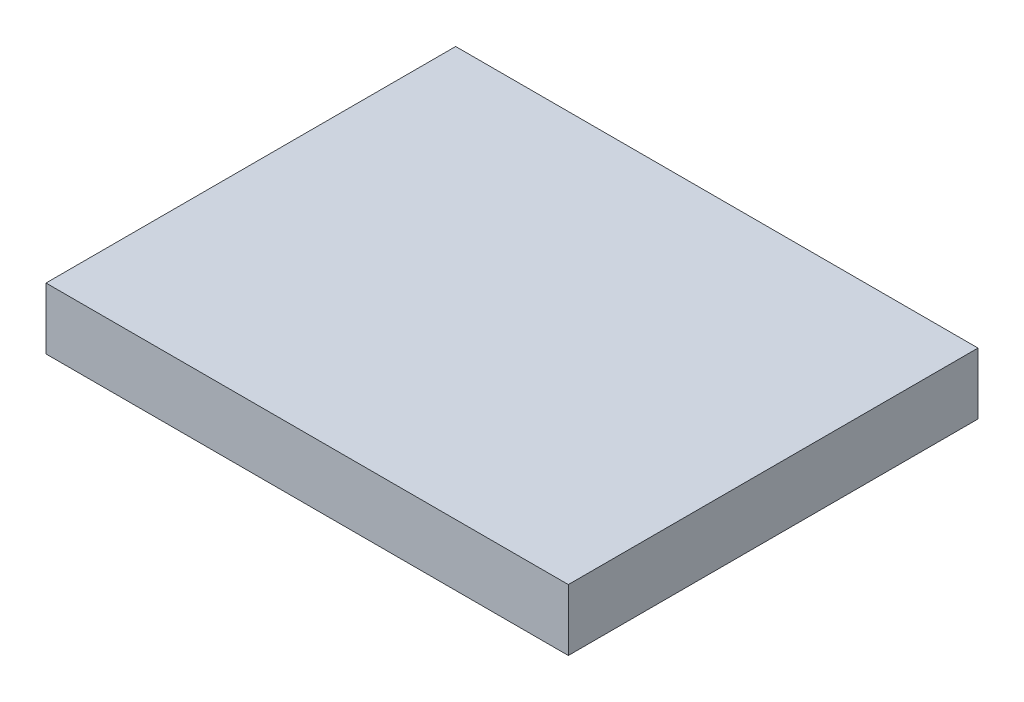
ISO-10303-21;
HEADER;
FILE_DESCRIPTION(('STEP AP214'),'2;1');
FILE_NAME('part.step','',(''),(''),'','','');
FILE_SCHEMA(('AUTOMOTIVE_DESIGN { 1 0 10303 214 1 1 1 1 }'));
ENDSEC;
DATA;
#1=APPLICATION_CONTEXT('core data for automotive mechanical design processes');
#2=APPLICATION_PROTOCOL_DEFINITION('international standard','automotive_design',2000,#1);
#3=PRODUCT_CONTEXT('',#1,'mechanical');
#4=PRODUCT('Part','Part','',(#3));
#5=PRODUCT_RELATED_PRODUCT_CATEGORY('part','',(#4));
#6=PRODUCT_DEFINITION_FORMATION('','',#4);
#7=PRODUCT_DEFINITION_CONTEXT('part definition',#1,'design');
#8=PRODUCT_DEFINITION('design','',#6,#7);
#9=PRODUCT_DEFINITION_SHAPE('','',#8);
#10=(LENGTH_UNIT() NAMED_UNIT(*) SI_UNIT(.MILLI.,.METRE.));
#11=(NAMED_UNIT(*) PLANE_ANGLE_UNIT() SI_UNIT($,.RADIAN.));
#12=(NAMED_UNIT(*) SI_UNIT($,.STERADIAN.) SOLID_ANGLE_UNIT());
#13=UNCERTAINTY_MEASURE_WITH_UNIT(LENGTH_MEASURE(1.E-05),#10,'distance_accuracy_value','');
#14=(GEOMETRIC_REPRESENTATION_CONTEXT(3) GLOBAL_UNCERTAINTY_ASSIGNED_CONTEXT((#13)) GLOBAL_UNIT_ASSIGNED_CONTEXT((#10,
#11,#12)) REPRESENTATION_CONTEXT('',''));
#15=CARTESIAN_POINT('',(0.,0.,0.));
#16=DIRECTION('',(0.,0.,1.));
#17=DIRECTION('',(1.,0.,0.));
#18=AXIS2_PLACEMENT_3D('',#15,#16,#17);
#19=CARTESIAN_POINT('',(25.5,6.,-20.));
#20=DIRECTION('',(-1.,0.,0.));
#21=DIRECTION('',(0.,0.,1.));
#22=AXIS2_PLACEMENT_3D('',#19,#20,#21);
#23=PLANE('',#22);
#24=DIRECTION('',(0.,0.,-1.));
#25=VECTOR('',#24,1.);
#26=CARTESIAN_POINT('',(25.5,0.,-20.));
#27=LINE('',#26,#25);
#28=CARTESIAN_POINT('',(25.5,0.,20.));
#29=VERTEX_POINT('',#28);
#30=CARTESIAN_POINT('',(25.5,0.,-20.));
#31=VERTEX_POINT('',#30);
#32=EDGE_CURVE('E98',#29,#31,#27,.T.);
#33=ORIENTED_EDGE('',*,*,#32,.T.);
#34=DIRECTION('',(0.,-1.,0.));
#35=VECTOR('',#34,1.);
#36=CARTESIAN_POINT('',(25.5,6.,-20.));
#37=LINE('',#36,#35);
#38=CARTESIAN_POINT('',(25.5,6.,-20.));
#39=VERTEX_POINT('',#38);
#40=EDGE_CURVE('E11',#39,#31,#37,.T.);
#41=ORIENTED_EDGE('',*,*,#40,.F.);
#42=DIRECTION('',(0.,0.,-1.));
#43=VECTOR('',#42,1.);
#44=CARTESIAN_POINT('',(25.5,6.,-20.));
#45=LINE('',#44,#43);
#46=CARTESIAN_POINT('',(25.5,6.,20.));
#47=VERTEX_POINT('',#46);
#48=EDGE_CURVE('E86',#47,#39,#45,.T.);
#49=ORIENTED_EDGE('',*,*,#48,.F.);
#50=DIRECTION('',(0.,-1.,0.));
#51=VECTOR('',#50,1.);
#52=CARTESIAN_POINT('',(25.5,6.,20.));
#53=LINE('',#52,#51);
#54=EDGE_CURVE('E94',#47,#29,#53,.T.);
#55=ORIENTED_EDGE('',*,*,#54,.T.);
#56=EDGE_LOOP('',(#33,#41,#49,#55));
#57=FACE_BOUND('',#56,.T.);
#58=ADVANCED_FACE('F35',(#57),#23,.F.);
#59=CARTESIAN_POINT('',(-25.5,6.,-20.));
#60=DIRECTION('',(0.,0.,1.));
#61=DIRECTION('',(1.,0.,0.));
#62=AXIS2_PLACEMENT_3D('',#59,#60,#61);
#63=PLANE('',#62);
#64=DIRECTION('',(-1.,0.,0.));
#65=VECTOR('',#64,1.);
#66=CARTESIAN_POINT('',(-25.5,0.,-20.));
#67=LINE('',#66,#65);
#68=CARTESIAN_POINT('',(-25.5,0.,-20.));
#69=VERTEX_POINT('',#68);
#70=EDGE_CURVE('E90',#31,#69,#67,.T.);
#71=ORIENTED_EDGE('',*,*,#70,.T.);
#72=DIRECTION('',(0.,-1.,0.));
#73=VECTOR('',#72,1.);
#74=CARTESIAN_POINT('',(-25.5,6.,-20.));
#75=LINE('',#74,#73);
#76=CARTESIAN_POINT('',(-25.5,6.,-20.));
#77=VERTEX_POINT('',#76);
#78=EDGE_CURVE('E43',#77,#69,#75,.T.);
#79=ORIENTED_EDGE('',*,*,#78,.F.);
#80=DIRECTION('',(-1.,0.,0.));
#81=VECTOR('',#80,1.);
#82=CARTESIAN_POINT('',(-25.5,6.,-20.));
#83=LINE('',#82,#81);
#84=EDGE_CURVE('E81',#39,#77,#83,.T.);
#85=ORIENTED_EDGE('',*,*,#84,.F.);
#86=ORIENTED_EDGE('',*,*,#40,.T.);
#87=EDGE_LOOP('',(#71,#79,#85,#86));
#88=FACE_BOUND('',#87,.T.);
#89=ADVANCED_FACE('F89',(#88),#63,.F.);
#90=CARTESIAN_POINT('',(-25.5,6.,-20.));
#91=DIRECTION('',(1.,0.,0.));
#92=DIRECTION('',(0.,0.,-1.));
#93=AXIS2_PLACEMENT_3D('',#90,#91,#92);
#94=PLANE('',#93);
#95=DIRECTION('',(0.,0.,1.));
#96=VECTOR('',#95,1.);
#97=CARTESIAN_POINT('',(-25.5,0.,-20.));
#98=LINE('',#97,#96);
#99=CARTESIAN_POINT('',(-25.5,0.,20.));
#100=VERTEX_POINT('',#99);
#101=EDGE_CURVE('E68',#69,#100,#98,.T.);
#102=ORIENTED_EDGE('',*,*,#101,.T.);
#103=DIRECTION('',(0.,-1.,0.));
#104=VECTOR('',#103,1.);
#105=CARTESIAN_POINT('',(-25.5,6.,20.));
#106=LINE('',#105,#104);
#107=CARTESIAN_POINT('',(-25.5,6.,20.));
#108=VERTEX_POINT('',#107);
#109=EDGE_CURVE('E91',#108,#100,#106,.T.);
#110=ORIENTED_EDGE('',*,*,#109,.F.);
#111=DIRECTION('',(0.,0.,1.));
#112=VECTOR('',#111,1.);
#113=CARTESIAN_POINT('',(-25.5,6.,-20.));
#114=LINE('',#113,#112);
#115=EDGE_CURVE('E84',#77,#108,#114,.T.);
#116=ORIENTED_EDGE('',*,*,#115,.F.);
#117=ORIENTED_EDGE('',*,*,#78,.T.);
#118=EDGE_LOOP('',(#102,#110,#116,#117));
#119=FACE_BOUND('',#118,.T.);
#120=ADVANCED_FACE('F92',(#119),#94,.F.);
#121=CARTESIAN_POINT('',(-25.5,6.,20.));
#122=DIRECTION('',(0.,0.,-1.));
#123=DIRECTION('',(-1.,0.,0.));
#124=AXIS2_PLACEMENT_3D('',#121,#122,#123);
#125=PLANE('',#124);
#126=DIRECTION('',(1.,0.,0.));
#127=VECTOR('',#126,1.);
#128=CARTESIAN_POINT('',(-25.5,0.,20.));
#129=LINE('',#128,#127);
#130=EDGE_CURVE('E74',#100,#29,#129,.T.);
#131=ORIENTED_EDGE('',*,*,#130,.T.);
#132=ORIENTED_EDGE('',*,*,#54,.F.);
#133=DIRECTION('',(1.,0.,0.));
#134=VECTOR('',#133,1.);
#135=CARTESIAN_POINT('',(-25.5,6.,20.));
#136=LINE('',#135,#134);
#137=EDGE_CURVE('E51',#108,#47,#136,.T.);
#138=ORIENTED_EDGE('',*,*,#137,.F.);
#139=ORIENTED_EDGE('',*,*,#109,.T.);
#140=EDGE_LOOP('',(#131,#132,#138,#139));
#141=FACE_BOUND('',#140,.T.);
#142=ADVANCED_FACE('F105',(#141),#125,.F.);
#143=CARTESIAN_POINT('',(0.,6.,0.));
#144=DIRECTION('',(0.,1.,0.));
#145=DIRECTION('',(0.,0.,1.));
#146=AXIS2_PLACEMENT_3D('',#143,#144,#145);
#147=PLANE('',#146);
#148=ORIENTED_EDGE('',*,*,#48,.T.);
#149=ORIENTED_EDGE('',*,*,#84,.T.);
#150=ORIENTED_EDGE('',*,*,#115,.T.);
#151=ORIENTED_EDGE('',*,*,#137,.T.);
#152=EDGE_LOOP('',(#148,#149,#150,#151));
#153=FACE_BOUND('',#152,.T.);
#154=ADVANCED_FACE('F82',(#153),#147,.T.);
#155=CARTESIAN_POINT('',(0.,0.,0.));
#156=DIRECTION('',(0.,1.,0.));
#157=DIRECTION('',(0.,0.,1.));
#158=AXIS2_PLACEMENT_3D('',#155,#156,#157);
#159=PLANE('',#158);
#160=ORIENTED_EDGE('',*,*,#32,.F.);
#161=ORIENTED_EDGE('',*,*,#130,.F.);
#162=ORIENTED_EDGE('',*,*,#101,.F.);
#163=ORIENTED_EDGE('',*,*,#70,.F.);
#164=EDGE_LOOP('',(#160,#161,#162,#163));
#165=FACE_BOUND('',#164,.T.);
#166=ADVANCED_FACE('F108',(#165),#159,.F.);
#167=CLOSED_SHELL('',(#58,#89,#120,#142,#154,#166));
#168=MANIFOLD_SOLID_BREP('B2',#167);
#169=ADVANCED_BREP_SHAPE_REPRESENTATION('',(#18,#168),#14);
#170=SHAPE_DEFINITION_REPRESENTATION(#9,#169);
ENDSEC;
END-ISO-10303-21;
